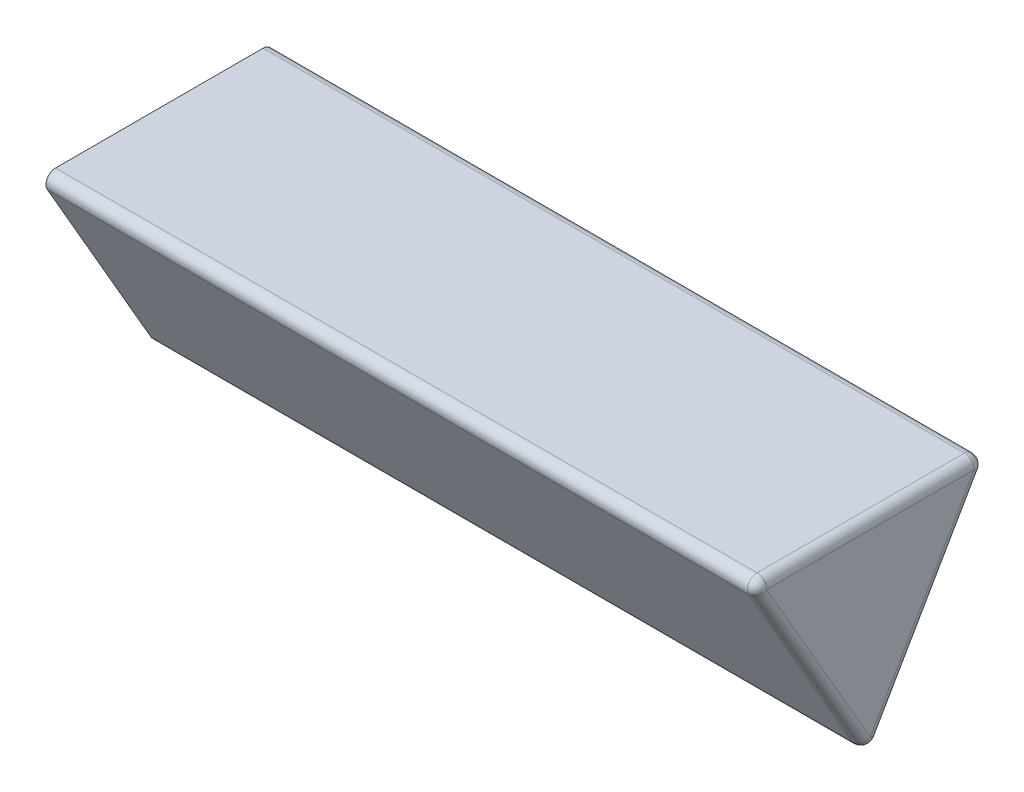
ISO-10303-21;
HEADER;
FILE_DESCRIPTION(('STEP AP214'),'2;1');
FILE_NAME('part.step','',(''),(''),'','','');
FILE_SCHEMA(('AUTOMOTIVE_DESIGN { 1 0 10303 214 1 1 1 1 }'));
ENDSEC;
DATA;
#1=APPLICATION_CONTEXT('core data for automotive mechanical design processes');
#2=APPLICATION_PROTOCOL_DEFINITION('international standard','automotive_design',2000,#1);
#3=PRODUCT_CONTEXT('',#1,'mechanical');
#4=PRODUCT('Part','Part','',(#3));
#5=PRODUCT_RELATED_PRODUCT_CATEGORY('part','',(#4));
#6=PRODUCT_DEFINITION_FORMATION('','',#4);
#7=PRODUCT_DEFINITION_CONTEXT('part definition',#1,'design');
#8=PRODUCT_DEFINITION('design','',#6,#7);
#9=PRODUCT_DEFINITION_SHAPE('','',#8);
#10=(LENGTH_UNIT() NAMED_UNIT(*) SI_UNIT(.MILLI.,.METRE.));
#11=(NAMED_UNIT(*) PLANE_ANGLE_UNIT() SI_UNIT($,.RADIAN.));
#12=(NAMED_UNIT(*) SI_UNIT($,.STERADIAN.) SOLID_ANGLE_UNIT());
#13=UNCERTAINTY_MEASURE_WITH_UNIT(LENGTH_MEASURE(1.E-05),#10,'distance_accuracy_value','');
#14=(GEOMETRIC_REPRESENTATION_CONTEXT(3) GLOBAL_UNCERTAINTY_ASSIGNED_CONTEXT((#13)) GLOBAL_UNIT_ASSIGNED_CONTEXT((#10,
#11,#12)) REPRESENTATION_CONTEXT('',''));
#15=CARTESIAN_POINT('',(0.,0.,0.));
#16=DIRECTION('',(0.,0.,1.));
#17=DIRECTION('',(1.,0.,0.));
#18=AXIS2_PLACEMENT_3D('',#15,#16,#17);
#19=CARTESIAN_POINT('',(0.,0.,0.));
#20=DIRECTION('',(1.,0.,0.));
#21=DIRECTION('',(0.,0.,-1.));
#22=AXIS2_PLACEMENT_3D('',#19,#20,#21);
#23=PLANE('',#22);
#24=DIRECTION('',(0.,0.866025403784439,-0.5));
#25=VECTOR('',#24,1.);
#26=CARTESIAN_POINT('',(0.,-36.6617420935412,0.));
#27=LINE('',#26,#25);
#28=CARTESIAN_POINT('',(0.,-32.8517420935412,-2.19970452561247));
#29=VERTEX_POINT('',#28);
#30=CARTESIAN_POINT('',(0.,14.5208710467706,-29.5502954743875));
#31=VERTEX_POINT('',#30);
#32=EDGE_CURVE('E174',#29,#31,#27,.T.);
#33=ORIENTED_EDGE('',*,*,#32,.F.);
#34=CARTESIAN_POINT('',(0.,-31.5817420935412,0.));
#35=DIRECTION('',(1.,0.,0.));
#36=DIRECTION('',(0.,0.,-1.));
#37=AXIS2_PLACEMENT_3D('',#34,#35,#36);
#38=CIRCLE('',#37,2.54);
#39=CARTESIAN_POINT('',(0.,-32.8517420935412,2.19970452561247));
#40=VERTEX_POINT('',#39);
#41=EDGE_CURVE('E234',#29,#40,#38,.F.);
#42=ORIENTED_EDGE('',*,*,#41,.T.);
#43=DIRECTION('',(0.,-0.866025403784439,-0.5));
#44=VECTOR('',#43,1.);
#45=CARTESIAN_POINT('',(0.,18.3308710467706,31.75));
#46=LINE('',#45,#44);
#47=CARTESIAN_POINT('',(0.,14.5208710467706,29.5502954743875));
#48=VERTEX_POINT('',#47);
#49=EDGE_CURVE('E180',#48,#40,#46,.T.);
#50=ORIENTED_EDGE('',*,*,#49,.F.);
#51=CARTESIAN_POINT('',(0.,15.7908710467706,27.350590948775));
#52=DIRECTION('',(1.,0.,0.));
#53=DIRECTION('',(0.,0.,-1.));
#54=AXIS2_PLACEMENT_3D('',#51,#52,#53);
#55=CIRCLE('',#54,2.54);
#56=CARTESIAN_POINT('',(0.,18.3308710467706,27.350590948775));
#57=VERTEX_POINT('',#56);
#58=EDGE_CURVE('E231',#48,#57,#55,.F.);
#59=ORIENTED_EDGE('',*,*,#58,.T.);
#60=DIRECTION('',(0.,0.,1.));
#61=VECTOR('',#60,1.);
#62=CARTESIAN_POINT('',(0.,18.3308710467706,-31.75));
#63=LINE('',#62,#61);
#64=CARTESIAN_POINT('',(0.,18.3308710467706,-27.3505909487751));
#65=VERTEX_POINT('',#64);
#66=EDGE_CURVE('E187',#65,#57,#63,.T.);
#67=ORIENTED_EDGE('',*,*,#66,.F.);
#68=CARTESIAN_POINT('',(0.,15.7908710467706,-27.3505909487751));
#69=DIRECTION('',(1.,0.,0.));
#70=DIRECTION('',(0.,0.,-1.));
#71=AXIS2_PLACEMENT_3D('',#68,#69,#70);
#72=CIRCLE('',#71,2.54);
#73=EDGE_CURVE('E228',#65,#31,#72,.F.);
#74=ORIENTED_EDGE('',*,*,#73,.T.);
#75=EDGE_LOOP('',(#33,#42,#50,#59,#67,#74));
#76=FACE_BOUND('',#75,.T.);
#77=DIRECTION('',(0.,-0.866025403784438,-0.5));
#78=VECTOR('',#77,1.);
#79=CARTESIAN_POINT('',(0.,17.4143274944321,30.1625));
#80=LINE('',#79,#78);
#81=CARTESIAN_POINT('',(0.,13.6043274944321,27.9627954743875));
#82=VERTEX_POINT('',#81);
#83=CARTESIAN_POINT('',(0.,-31.0186549888641,2.19970452561248));
#84=VERTEX_POINT('',#83);
#85=EDGE_CURVE('E155',#82,#84,#80,.T.);
#86=ORIENTED_EDGE('',*,*,#85,.T.);
#87=CARTESIAN_POINT('',(0.,-29.7486549888642,0.));
#88=DIRECTION('',(1.,0.,0.));
#89=DIRECTION('',(0.,0.,-1.));
#90=AXIS2_PLACEMENT_3D('',#87,#88,#89);
#91=CIRCLE('',#90,2.54);
#92=CARTESIAN_POINT('',(0.,-31.0186549888642,-2.19970452561247));
#93=VERTEX_POINT('',#92);
#94=EDGE_CURVE('E163',#84,#93,#91,.T.);
#95=ORIENTED_EDGE('',*,*,#94,.T.);
#96=DIRECTION('',(0.,0.866025403784438,-0.5));
#97=VECTOR('',#96,1.);
#98=CARTESIAN_POINT('',(0.,-34.8286549888642,0.));
#99=LINE('',#98,#97);
#100=CARTESIAN_POINT('',(0.,13.6043274944321,-27.9627954743875));
#101=VERTEX_POINT('',#100);
#102=EDGE_CURVE('E310',#93,#101,#99,.T.);
#103=ORIENTED_EDGE('',*,*,#102,.T.);
#104=CARTESIAN_POINT('',(0.,14.8743274944321,-25.7630909487751));
#105=DIRECTION('',(1.,0.,0.));
#106=DIRECTION('',(0.,0.,-1.));
#107=AXIS2_PLACEMENT_3D('',#104,#105,#106);
#108=CIRCLE('',#107,2.54);
#109=CARTESIAN_POINT('',(0.,17.4143274944321,-25.7630909487751));
#110=VERTEX_POINT('',#109);
#111=EDGE_CURVE('E162',#101,#110,#108,.T.);
#112=ORIENTED_EDGE('',*,*,#111,.T.);
#113=DIRECTION('',(0.,0.,1.));
#114=VECTOR('',#113,1.);
#115=CARTESIAN_POINT('',(0.,17.4143274944321,-30.1625));
#116=LINE('',#115,#114);
#117=CARTESIAN_POINT('',(0.,17.4143274944321,25.763090948775));
#118=VERTEX_POINT('',#117);
#119=EDGE_CURVE('E157',#110,#118,#116,.T.);
#120=ORIENTED_EDGE('',*,*,#119,.T.);
#121=CARTESIAN_POINT('',(0.,14.8743274944321,25.763090948775));
#122=DIRECTION('',(1.,0.,0.));
#123=DIRECTION('',(0.,0.,-1.));
#124=AXIS2_PLACEMENT_3D('',#121,#122,#123);
#125=CIRCLE('',#124,2.54);
#126=EDGE_CURVE('E153',#118,#82,#125,.T.);
#127=ORIENTED_EDGE('',*,*,#126,.T.);
#128=EDGE_LOOP('',(#86,#95,#103,#112,#120,#127));
#129=FACE_BOUND('',#128,.T.);
#130=ADVANCED_FACE('F41',(#76,#129),#23,.F.);
#131=CARTESIAN_POINT('',(187.452,-36.6617420935412,0.));
#132=DIRECTION('',(0.,0.5,0.866025403784438));
#133=DIRECTION('',(0.,-0.866025403784439,0.5));
#134=AXIS2_PLACEMENT_3D('',#131,#132,#133);
#135=PLANE('',#134);
#136=DIRECTION('',(-1.,0.,0.));
#137=VECTOR('',#136,1.);
#138=CARTESIAN_POINT('',(187.452,14.5208710467706,-29.5502954743875));
#139=LINE('',#138,#137);
#140=CARTESIAN_POINT('',(184.912,14.5208710467706,-29.5502954743875));
#141=VERTEX_POINT('',#140);
#142=EDGE_CURVE('E197',#31,#141,#139,.F.);
#143=ORIENTED_EDGE('',*,*,#142,.T.);
#144=DIRECTION('',(0.,0.866025403784439,-0.5));
#145=VECTOR('',#144,1.);
#146=CARTESIAN_POINT('',(184.912,-32.8517420935412,-2.19970452561247));
#147=LINE('',#146,#145);
#148=CARTESIAN_POINT('',(184.912,-32.8517420935412,-2.19970452561247));
#149=VERTEX_POINT('',#148);
#150=EDGE_CURVE('E272',#141,#149,#147,.F.);
#151=ORIENTED_EDGE('',*,*,#150,.T.);
#152=DIRECTION('',(-1.,0.,0.));
#153=VECTOR('',#152,1.);
#154=CARTESIAN_POINT('',(187.452,-32.8517420935412,-2.19970452561247));
#155=LINE('',#154,#153);
#156=EDGE_CURVE('E201',#149,#29,#155,.T.);
#157=ORIENTED_EDGE('',*,*,#156,.T.);
#158=ORIENTED_EDGE('',*,*,#32,.T.);
#159=EDGE_LOOP('',(#143,#151,#157,#158));
#160=FACE_BOUND('',#159,.T.);
#161=ADVANCED_FACE('F352',(#160),#135,.F.);
#162=CARTESIAN_POINT('',(187.452,18.3308710467706,-31.75));
#163=DIRECTION('',(0.,-1.,0.));
#164=DIRECTION('',(0.,0.,-1.));
#165=AXIS2_PLACEMENT_3D('',#162,#163,#164);
#166=PLANE('',#165);
#167=DIRECTION('',(-1.,0.,0.));
#168=VECTOR('',#167,1.);
#169=CARTESIAN_POINT('',(187.452,18.3308710467706,27.350590948775));
#170=LINE('',#169,#168);
#171=CARTESIAN_POINT('',(184.912,18.3308710467706,27.350590948775));
#172=VERTEX_POINT('',#171);
#173=EDGE_CURVE('E221',#57,#172,#170,.F.);
#174=ORIENTED_EDGE('',*,*,#173,.T.);
#175=DIRECTION('',(0.,0.,1.));
#176=VECTOR('',#175,1.);
#177=CARTESIAN_POINT('',(184.912,18.3308710467706,-27.3505909487751));
#178=LINE('',#177,#176);
#179=CARTESIAN_POINT('',(184.912,18.3308710467706,-27.3505909487751));
#180=VERTEX_POINT('',#179);
#181=EDGE_CURVE('E59',#172,#180,#178,.F.);
#182=ORIENTED_EDGE('',*,*,#181,.T.);
#183=DIRECTION('',(-1.,0.,0.));
#184=VECTOR('',#183,1.);
#185=CARTESIAN_POINT('',(187.452,18.3308710467706,-27.3505909487751));
#186=LINE('',#185,#184);
#187=EDGE_CURVE('E218',#180,#65,#186,.T.);
#188=ORIENTED_EDGE('',*,*,#187,.T.);
#189=ORIENTED_EDGE('',*,*,#66,.T.);
#190=EDGE_LOOP('',(#174,#182,#188,#189));
#191=FACE_BOUND('',#190,.T.);
#192=ADVANCED_FACE('F434',(#191),#166,.F.);
#193=CARTESIAN_POINT('',(187.452,18.3308710467706,31.75));
#194=DIRECTION('',(0.,0.5,-0.866025403784439));
#195=DIRECTION('',(0.,0.866025403784439,0.5));
#196=AXIS2_PLACEMENT_3D('',#193,#194,#195);
#197=PLANE('',#196);
#198=DIRECTION('',(-1.,0.,0.));
#199=VECTOR('',#198,1.);
#200=CARTESIAN_POINT('',(187.452,-32.8517420935412,2.19970452561247));
#201=LINE('',#200,#199);
#202=CARTESIAN_POINT('',(184.912,-32.8517420935412,2.19970452561247));
#203=VERTEX_POINT('',#202);
#204=EDGE_CURVE('E207',#40,#203,#201,.F.);
#205=ORIENTED_EDGE('',*,*,#204,.T.);
#206=DIRECTION('',(0.,-0.866025403784439,-0.5));
#207=VECTOR('',#206,1.);
#208=CARTESIAN_POINT('',(184.912,14.5208710467706,29.5502954743875));
#209=LINE('',#208,#207);
#210=CARTESIAN_POINT('',(184.912,14.5208710467706,29.5502954743875));
#211=VERTEX_POINT('',#210);
#212=EDGE_CURVE('E279',#203,#211,#209,.F.);
#213=ORIENTED_EDGE('',*,*,#212,.T.);
#214=DIRECTION('',(-1.,0.,0.));
#215=VECTOR('',#214,1.);
#216=CARTESIAN_POINT('',(187.452,14.5208710467706,29.5502954743875));
#217=LINE('',#216,#215);
#218=EDGE_CURVE('E204',#211,#48,#217,.T.);
#219=ORIENTED_EDGE('',*,*,#218,.T.);
#220=ORIENTED_EDGE('',*,*,#49,.T.);
#221=EDGE_LOOP('',(#205,#213,#219,#220));
#222=FACE_BOUND('',#221,.T.);
#223=ADVANCED_FACE('F367',(#222),#197,.F.);
#224=CARTESIAN_POINT('',(187.452,0.,0.));
#225=DIRECTION('',(1.,0.,0.));
#226=DIRECTION('',(0.,0.,-1.));
#227=AXIS2_PLACEMENT_3D('',#224,#225,#226);
#228=PLANE('',#227);
#229=DIRECTION('',(0.,-0.866025403784439,-0.5));
#230=VECTOR('',#229,1.);
#231=CARTESIAN_POINT('',(187.452,-31.5817420935413,0.));
#232=LINE('',#231,#230);
#233=CARTESIAN_POINT('',(187.452,15.7908710467706,27.350590948775));
#234=VERTEX_POINT('',#233);
#235=CARTESIAN_POINT('',(187.452,-31.5817420935412,0.));
#236=VERTEX_POINT('',#235);
#237=EDGE_CURVE('E265',#234,#236,#232,.T.);
#238=ORIENTED_EDGE('',*,*,#237,.T.);
#239=DIRECTION('',(0.,0.866025403784439,-0.5));
#240=VECTOR('',#239,1.);
#241=CARTESIAN_POINT('',(187.452,15.7908710467706,-27.3505909487751));
#242=LINE('',#241,#240);
#243=CARTESIAN_POINT('',(187.452,15.7908710467706,-27.3505909487751));
#244=VERTEX_POINT('',#243);
#245=EDGE_CURVE('E268',#236,#244,#242,.T.);
#246=ORIENTED_EDGE('',*,*,#245,.T.);
#247=DIRECTION('',(0.,0.,1.));
#248=VECTOR('',#247,1.);
#249=CARTESIAN_POINT('',(187.452,15.7908710467706,27.350590948775));
#250=LINE('',#249,#248);
#251=EDGE_CURVE('E262',#244,#234,#250,.T.);
#252=ORIENTED_EDGE('',*,*,#251,.T.);
#253=EDGE_LOOP('',(#238,#246,#252));
#254=FACE_BOUND('',#253,.T.);
#255=ADVANCED_FACE('F438',(#254),#228,.T.);
#256=CARTESIAN_POINT('',(186.182,-34.8286549888642,0.));
#257=DIRECTION('',(0.,0.5,0.866025403784439));
#258=DIRECTION('',(0.,-0.866025403784439,0.5));
#259=AXIS2_PLACEMENT_3D('',#256,#257,#258);
#260=PLANE('',#259);
#261=DIRECTION('',(-1.,0.,0.));
#262=VECTOR('',#261,1.);
#263=CARTESIAN_POINT('',(186.182,-31.0186549888642,-2.19970452561247));
#264=LINE('',#263,#262);
#265=CARTESIAN_POINT('',(183.642,-31.0186549888642,-2.19970452561247));
#266=VERTEX_POINT('',#265);
#267=EDGE_CURVE('E193',#93,#266,#264,.F.);
#268=ORIENTED_EDGE('',*,*,#267,.T.);
#269=DIRECTION('',(0.,0.866025403784439,-0.5));
#270=VECTOR('',#269,1.);
#271=CARTESIAN_POINT('',(183.642,-34.8286549888642,0.));
#272=LINE('',#271,#270);
#273=CARTESIAN_POINT('',(183.642,13.6043274944321,-27.9627954743875));
#274=VERTEX_POINT('',#273);
#275=EDGE_CURVE('E241',#266,#274,#272,.T.);
#276=ORIENTED_EDGE('',*,*,#275,.T.);
#277=DIRECTION('',(-1.,0.,0.));
#278=VECTOR('',#277,1.);
#279=CARTESIAN_POINT('',(0.,13.6043274944321,-27.9627954743875));
#280=LINE('',#279,#278);
#281=EDGE_CURVE('E184',#274,#101,#280,.T.);
#282=ORIENTED_EDGE('',*,*,#281,.T.);
#283=ORIENTED_EDGE('',*,*,#102,.F.);
#284=EDGE_LOOP('',(#268,#276,#282,#283));
#285=FACE_BOUND('',#284,.T.);
#286=ADVANCED_FACE('F385',(#285),#260,.T.);
#287=CARTESIAN_POINT('',(186.182,17.4143274944321,-30.1625));
#288=DIRECTION('',(0.,-1.,0.));
#289=DIRECTION('',(0.,0.,-1.));
#290=AXIS2_PLACEMENT_3D('',#287,#288,#289);
#291=PLANE('',#290);
#292=DIRECTION('',(-1.,0.,0.));
#293=VECTOR('',#292,1.);
#294=CARTESIAN_POINT('',(186.182,17.4143274944321,-25.7630909487751));
#295=LINE('',#294,#293);
#296=CARTESIAN_POINT('',(183.642,17.4143274944321,-25.7630909487751));
#297=VERTEX_POINT('',#296);
#298=EDGE_CURVE('E211',#110,#297,#295,.F.);
#299=ORIENTED_EDGE('',*,*,#298,.T.);
#300=DIRECTION('',(0.,0.,1.));
#301=VECTOR('',#300,1.);
#302=CARTESIAN_POINT('',(183.642,17.4143274944321,-30.1625));
#303=LINE('',#302,#301);
#304=CARTESIAN_POINT('',(183.642,17.4143274944321,25.763090948775));
#305=VERTEX_POINT('',#304);
#306=EDGE_CURVE('E51',#297,#305,#303,.T.);
#307=ORIENTED_EDGE('',*,*,#306,.T.);
#308=DIRECTION('',(-1.,0.,0.));
#309=VECTOR('',#308,1.);
#310=CARTESIAN_POINT('',(0.,17.4143274944321,25.763090948775));
#311=LINE('',#310,#309);
#312=EDGE_CURVE('E215',#305,#118,#311,.T.);
#313=ORIENTED_EDGE('',*,*,#312,.T.);
#314=ORIENTED_EDGE('',*,*,#119,.F.);
#315=EDGE_LOOP('',(#299,#307,#313,#314));
#316=FACE_BOUND('',#315,.T.);
#317=ADVANCED_FACE('F413',(#316),#291,.T.);
#318=CARTESIAN_POINT('',(186.182,17.4143274944321,30.1625));
#319=DIRECTION('',(0.,0.5,-0.866025403784439));
#320=DIRECTION('',(0.,0.866025403784439,0.5));
#321=AXIS2_PLACEMENT_3D('',#318,#319,#320);
#322=PLANE('',#321);
#323=DIRECTION('',(-1.,0.,0.));
#324=VECTOR('',#323,1.);
#325=CARTESIAN_POINT('',(186.182,13.6043274944321,27.9627954743875));
#326=LINE('',#325,#324);
#327=CARTESIAN_POINT('',(183.642,13.6043274944321,27.9627954743875));
#328=VERTEX_POINT('',#327);
#329=EDGE_CURVE('E168',#82,#328,#326,.F.);
#330=ORIENTED_EDGE('',*,*,#329,.T.);
#331=DIRECTION('',(0.,-0.866025403784439,-0.5));
#332=VECTOR('',#331,1.);
#333=CARTESIAN_POINT('',(183.642,17.4143274944321,30.1625));
#334=LINE('',#333,#332);
#335=CARTESIAN_POINT('',(183.642,-31.0186549888642,2.19970452561248));
#336=VERTEX_POINT('',#335);
#337=EDGE_CURVE('E257',#328,#336,#334,.T.);
#338=ORIENTED_EDGE('',*,*,#337,.T.);
#339=DIRECTION('',(-1.,0.,0.));
#340=VECTOR('',#339,1.);
#341=CARTESIAN_POINT('',(0.,-31.0186549888642,2.19970452561248));
#342=LINE('',#341,#340);
#343=EDGE_CURVE('E171',#336,#84,#342,.T.);
#344=ORIENTED_EDGE('',*,*,#343,.T.);
#345=ORIENTED_EDGE('',*,*,#85,.F.);
#346=EDGE_LOOP('',(#330,#338,#344,#345));
#347=FACE_BOUND('',#346,.T.);
#348=ADVANCED_FACE('F167',(#347),#322,.T.);
#349=CARTESIAN_POINT('',(186.182,0.,0.));
#350=DIRECTION('',(1.,0.,0.));
#351=DIRECTION('',(0.,0.,-1.));
#352=AXIS2_PLACEMENT_3D('',#349,#350,#351);
#353=PLANE('',#352);
#354=DIRECTION('',(0.,0.,1.));
#355=VECTOR('',#354,1.);
#356=CARTESIAN_POINT('',(186.182,14.8743274944321,0.));
#357=LINE('',#356,#355);
#358=CARTESIAN_POINT('',(186.182,14.8743274944321,25.763090948775));
#359=VERTEX_POINT('',#358);
#360=CARTESIAN_POINT('',(186.182,14.8743274944321,-25.7630909487751));
#361=VERTEX_POINT('',#360);
#362=EDGE_CURVE('E244',#359,#361,#357,.F.);
#363=ORIENTED_EDGE('',*,*,#362,.T.);
#364=DIRECTION('',(0.,0.866025403784439,-0.5));
#365=VECTOR('',#364,1.);
#366=CARTESIAN_POINT('',(186.182,-7.43716374721605,-12.8815454743875));
#367=LINE('',#366,#365);
#368=CARTESIAN_POINT('',(186.182,-29.7486549888642,0.));
#369=VERTEX_POINT('',#368);
#370=EDGE_CURVE('E250',#361,#369,#367,.F.);
#371=ORIENTED_EDGE('',*,*,#370,.T.);
#372=DIRECTION('',(0.,-0.866025403784439,-0.5));
#373=VECTOR('',#372,1.);
#374=CARTESIAN_POINT('',(186.182,-7.43716374721604,12.8815454743875));
#375=LINE('',#374,#373);
#376=EDGE_CURVE('E247',#369,#359,#375,.F.);
#377=ORIENTED_EDGE('',*,*,#376,.T.);
#378=EDGE_LOOP('',(#363,#371,#377));
#379=FACE_BOUND('',#378,.T.);
#380=ADVANCED_FACE('F420',(#379),#353,.F.);
#381=CARTESIAN_POINT('',(186.182,-29.7486549888642,0.));
#382=DIRECTION('',(1.,0.,0.));
#383=DIRECTION('',(0.,0.,-1.));
#384=AXIS2_PLACEMENT_3D('',#381,#382,#383);
#385=CYLINDRICAL_SURFACE('',#384,2.54);
#386=ORIENTED_EDGE('',*,*,#343,.F.);
#387=CARTESIAN_POINT('',(183.642,-29.7486549888642,0.));
#388=DIRECTION('',(1.,0.,0.));
#389=DIRECTION('',(0.,0.,-1.));
#390=AXIS2_PLACEMENT_3D('',#387,#388,#389);
#391=CIRCLE('',#390,2.54);
#392=EDGE_CURVE('E254',#336,#266,#391,.T.);
#393=ORIENTED_EDGE('',*,*,#392,.T.);
#394=ORIENTED_EDGE('',*,*,#267,.F.);
#395=ORIENTED_EDGE('',*,*,#94,.F.);
#396=EDGE_LOOP('',(#386,#393,#394,#395));
#397=FACE_BOUND('',#396,.T.);
#398=ADVANCED_FACE('F389',(#397),#385,.F.);
#399=CARTESIAN_POINT('',(187.452,-31.5817420935412,0.));
#400=DIRECTION('',(-1.,0.,0.));
#401=DIRECTION('',(0.,0.,1.));
#402=AXIS2_PLACEMENT_3D('',#399,#400,#401);
#403=CYLINDRICAL_SURFACE('',#402,2.54);
#404=ORIENTED_EDGE('',*,*,#156,.F.);
#405=CARTESIAN_POINT('',(184.912,-31.5817420935412,0.));
#406=DIRECTION('',(-1.,0.,0.));
#407=DIRECTION('',(0.,0.,1.));
#408=AXIS2_PLACEMENT_3D('',#405,#406,#407);
#409=CIRCLE('',#408,2.54);
#410=EDGE_CURVE('E276',#149,#203,#409,.T.);
#411=ORIENTED_EDGE('',*,*,#410,.T.);
#412=ORIENTED_EDGE('',*,*,#204,.F.);
#413=ORIENTED_EDGE('',*,*,#41,.F.);
#414=EDGE_LOOP('',(#404,#411,#412,#413));
#415=FACE_BOUND('',#414,.T.);
#416=ADVANCED_FACE('F364',(#415),#403,.T.);
#417=CARTESIAN_POINT('',(186.182,14.8743274944321,25.763090948775));
#418=DIRECTION('',(1.,0.,0.));
#419=DIRECTION('',(0.,0.,-1.));
#420=AXIS2_PLACEMENT_3D('',#417,#418,#419);
#421=CYLINDRICAL_SURFACE('',#420,2.54);
#422=ORIENTED_EDGE('',*,*,#312,.F.);
#423=CARTESIAN_POINT('',(183.642,14.8743274944321,25.763090948775));
#424=DIRECTION('',(1.,0.,0.));
#425=DIRECTION('',(0.,0.,-1.));
#426=AXIS2_PLACEMENT_3D('',#423,#424,#425);
#427=CIRCLE('',#426,2.54);
#428=EDGE_CURVE('E178',#305,#328,#427,.T.);
#429=ORIENTED_EDGE('',*,*,#428,.T.);
#430=ORIENTED_EDGE('',*,*,#329,.F.);
#431=ORIENTED_EDGE('',*,*,#126,.F.);
#432=EDGE_LOOP('',(#422,#429,#430,#431));
#433=FACE_BOUND('',#432,.T.);
#434=ADVANCED_FACE('F176',(#433),#421,.F.);
#435=CARTESIAN_POINT('',(187.452,15.7908710467706,27.350590948775));
#436=DIRECTION('',(-1.,0.,0.));
#437=DIRECTION('',(0.,0.,1.));
#438=AXIS2_PLACEMENT_3D('',#435,#436,#437);
#439=CYLINDRICAL_SURFACE('',#438,2.54);
#440=ORIENTED_EDGE('',*,*,#218,.F.);
#441=CARTESIAN_POINT('',(184.912,15.7908710467706,27.350590948775));
#442=DIRECTION('',(-1.,0.,0.));
#443=DIRECTION('',(0.,0.,1.));
#444=AXIS2_PLACEMENT_3D('',#441,#442,#443);
#445=CIRCLE('',#444,2.54);
#446=EDGE_CURVE('E67',#211,#172,#445,.T.);
#447=ORIENTED_EDGE('',*,*,#446,.T.);
#448=ORIENTED_EDGE('',*,*,#173,.F.);
#449=ORIENTED_EDGE('',*,*,#58,.F.);
#450=EDGE_LOOP('',(#440,#447,#448,#449));
#451=FACE_BOUND('',#450,.T.);
#452=ADVANCED_FACE('F448',(#451),#439,.T.);
#453=CARTESIAN_POINT('',(186.182,14.8743274944321,-25.7630909487751));
#454=DIRECTION('',(1.,0.,0.));
#455=DIRECTION('',(0.,0.,-1.));
#456=AXIS2_PLACEMENT_3D('',#453,#454,#455);
#457=CYLINDRICAL_SURFACE('',#456,2.54);
#458=ORIENTED_EDGE('',*,*,#281,.F.);
#459=CARTESIAN_POINT('',(183.642,14.8743274944321,-25.7630909487751));
#460=DIRECTION('',(1.,0.,0.));
#461=DIRECTION('',(0.,0.,-1.));
#462=AXIS2_PLACEMENT_3D('',#459,#460,#461);
#463=CIRCLE('',#462,2.54);
#464=EDGE_CURVE('E237',#274,#297,#463,.T.);
#465=ORIENTED_EDGE('',*,*,#464,.T.);
#466=ORIENTED_EDGE('',*,*,#298,.F.);
#467=ORIENTED_EDGE('',*,*,#111,.F.);
#468=EDGE_LOOP('',(#458,#465,#466,#467));
#469=FACE_BOUND('',#468,.T.);
#470=ADVANCED_FACE('F402',(#469),#457,.F.);
#471=CARTESIAN_POINT('',(187.452,15.7908710467706,-27.3505909487751));
#472=DIRECTION('',(-1.,0.,0.));
#473=DIRECTION('',(0.,0.,1.));
#474=AXIS2_PLACEMENT_3D('',#471,#472,#473);
#475=CYLINDRICAL_SURFACE('',#474,2.54);
#476=ORIENTED_EDGE('',*,*,#187,.F.);
#477=CARTESIAN_POINT('',(184.912,15.7908710467706,-27.3505909487751));
#478=DIRECTION('',(-1.,0.,0.));
#479=DIRECTION('',(0.,0.,1.));
#480=AXIS2_PLACEMENT_3D('',#477,#478,#479);
#481=CIRCLE('',#480,2.54);
#482=EDGE_CURVE('E11',#180,#141,#481,.T.);
#483=ORIENTED_EDGE('',*,*,#482,.T.);
#484=ORIENTED_EDGE('',*,*,#142,.F.);
#485=ORIENTED_EDGE('',*,*,#73,.F.);
#486=EDGE_LOOP('',(#476,#483,#484,#485));
#487=FACE_BOUND('',#486,.T.);
#488=ADVANCED_FACE('F347',(#487),#475,.T.);
#489=CARTESIAN_POINT('',(183.642,18.6843274944321,27.9627954743875));
#490=DIRECTION('',(0.,-0.866025403784439,-0.5));
#491=DIRECTION('',(0.,0.5,-0.866025403784439));
#492=AXIS2_PLACEMENT_3D('',#489,#490,#491);
#493=CYLINDRICAL_SURFACE('',#492,2.54);
#494=CARTESIAN_POINT('',(183.642,-29.7486549888642,0.));
#495=DIRECTION('',(0.,0.866025403784438,0.5));
#496=DIRECTION('',(0.,-0.5,0.866025403784439));
#497=AXIS2_PLACEMENT_3D('',#494,#495,#496);
#498=CIRCLE('',#497,2.54);
#499=EDGE_CURVE('E302',#336,#369,#498,.T.);
#500=ORIENTED_EDGE('',*,*,#499,.F.);
#501=ORIENTED_EDGE('',*,*,#337,.F.);
#502=CARTESIAN_POINT('',(183.642,14.8743274944321,25.763090948775));
#503=DIRECTION('',(0.,-0.866025403784438,-0.5));
#504=DIRECTION('',(0.,0.5,-0.866025403784439));
#505=AXIS2_PLACEMENT_3D('',#502,#503,#504);
#506=CIRCLE('',#505,2.54);
#507=EDGE_CURVE('E306',#359,#328,#506,.T.);
#508=ORIENTED_EDGE('',*,*,#507,.F.);
#509=ORIENTED_EDGE('',*,*,#376,.F.);
#510=EDGE_LOOP('',(#500,#501,#508,#509));
#511=FACE_BOUND('',#510,.T.);
#512=ADVANCED_FACE('F418',(#511),#493,.F.);
#513=CARTESIAN_POINT('',(183.642,14.8743274944321,25.763090948775));
#514=DIRECTION('',(1.,0.,0.));
#515=DIRECTION('',(0.,0.,-1.));
#516=AXIS2_PLACEMENT_3D('',#513,#514,#515);
#517=SPHERICAL_SURFACE('',#516,2.54);
#518=ORIENTED_EDGE('',*,*,#507,.T.);
#519=ORIENTED_EDGE('',*,*,#428,.F.);
#520=CARTESIAN_POINT('',(183.642,14.8743274944321,25.763090948775));
#521=DIRECTION('',(0.,0.,1.));
#522=DIRECTION('',(1.,0.,0.));
#523=AXIS2_PLACEMENT_3D('',#520,#521,#522);
#524=CIRCLE('',#523,2.54);
#525=EDGE_CURVE('E298',#359,#305,#524,.T.);
#526=ORIENTED_EDGE('',*,*,#525,.F.);
#527=EDGE_LOOP('',(#518,#519,#526));
#528=FACE_BOUND('',#527,.T.);
#529=ADVANCED_FACE('F415',(#528),#517,.F.);
#530=CARTESIAN_POINT('',(183.642,-29.7486549888642,0.));
#531=DIRECTION('',(1.,0.,0.));
#532=DIRECTION('',(0.,0.,-1.));
#533=AXIS2_PLACEMENT_3D('',#530,#531,#532);
#534=SPHERICAL_SURFACE('',#533,2.54);
#535=ORIENTED_EDGE('',*,*,#392,.F.);
#536=ORIENTED_EDGE('',*,*,#499,.T.);
#537=CARTESIAN_POINT('',(183.642,-29.7486549888642,0.));
#538=DIRECTION('',(0.,-0.866025403784438,0.5));
#539=DIRECTION('',(0.,-0.5,-0.866025403784439));
#540=AXIS2_PLACEMENT_3D('',#537,#538,#539);
#541=CIRCLE('',#540,2.54);
#542=EDGE_CURVE('E295',#266,#369,#541,.T.);
#543=ORIENTED_EDGE('',*,*,#542,.F.);
#544=EDGE_LOOP('',(#535,#536,#543));
#545=FACE_BOUND('',#544,.T.);
#546=ADVANCED_FACE('F393',(#545),#534,.F.);
#547=CARTESIAN_POINT('',(183.642,14.8743274944321,-30.1625));
#548=DIRECTION('',(0.,0.,1.));
#549=DIRECTION('',(0.,-1.,0.));
#550=AXIS2_PLACEMENT_3D('',#547,#548,#549);
#551=CYLINDRICAL_SURFACE('',#550,2.54);
#552=ORIENTED_EDGE('',*,*,#525,.T.);
#553=ORIENTED_EDGE('',*,*,#306,.F.);
#554=CARTESIAN_POINT('',(183.642,14.8743274944321,-25.7630909487751));
#555=DIRECTION('',(0.,0.,1.));
#556=DIRECTION('',(1.,0.,0.));
#557=AXIS2_PLACEMENT_3D('',#554,#555,#556);
#558=CIRCLE('',#557,2.54);
#559=EDGE_CURVE('E292',#361,#297,#558,.T.);
#560=ORIENTED_EDGE('',*,*,#559,.F.);
#561=ORIENTED_EDGE('',*,*,#362,.F.);
#562=EDGE_LOOP('',(#552,#553,#560,#561));
#563=FACE_BOUND('',#562,.T.);
#564=ADVANCED_FACE('F410',(#563),#551,.F.);
#565=CARTESIAN_POINT('',(183.642,-33.5586549888642,2.19970452561248));
#566=DIRECTION('',(0.,0.866025403784439,-0.5));
#567=DIRECTION('',(0.,0.5,0.866025403784439));
#568=AXIS2_PLACEMENT_3D('',#565,#566,#567);
#569=CYLINDRICAL_SURFACE('',#568,2.54);
#570=ORIENTED_EDGE('',*,*,#542,.T.);
#571=ORIENTED_EDGE('',*,*,#370,.F.);
#572=CARTESIAN_POINT('',(183.642,14.8743274944321,-25.7630909487751));
#573=DIRECTION('',(0.,-0.866025403784438,0.5));
#574=DIRECTION('',(0.,-0.5,-0.866025403784439));
#575=AXIS2_PLACEMENT_3D('',#572,#573,#574);
#576=CIRCLE('',#575,2.54);
#577=EDGE_CURVE('E288',#274,#361,#576,.T.);
#578=ORIENTED_EDGE('',*,*,#577,.F.);
#579=ORIENTED_EDGE('',*,*,#275,.F.);
#580=EDGE_LOOP('',(#570,#571,#578,#579));
#581=FACE_BOUND('',#580,.T.);
#582=ADVANCED_FACE('F399',(#581),#569,.F.);
#583=CARTESIAN_POINT('',(183.642,14.8743274944321,-25.7630909487751));
#584=DIRECTION('',(1.,0.,0.));
#585=DIRECTION('',(0.,0.,-1.));
#586=AXIS2_PLACEMENT_3D('',#583,#584,#585);
#587=SPHERICAL_SURFACE('',#586,2.54);
#588=ORIENTED_EDGE('',*,*,#559,.T.);
#589=ORIENTED_EDGE('',*,*,#464,.F.);
#590=ORIENTED_EDGE('',*,*,#577,.T.);
#591=EDGE_LOOP('',(#588,#589,#590));
#592=FACE_BOUND('',#591,.T.);
#593=ADVANCED_FACE('F405',(#592),#587,.F.);
#594=CARTESIAN_POINT('',(184.912,15.7908710467706,27.350590948775));
#595=DIRECTION('',(1.,0.,0.));
#596=DIRECTION('',(0.,0.,-1.));
#597=AXIS2_PLACEMENT_3D('',#594,#595,#596);
#598=SPHERICAL_SURFACE('',#597,2.54);
#599=CARTESIAN_POINT('',(184.912,15.7908710467706,27.350590948775));
#600=DIRECTION('',(0.,0.,-1.));
#601=DIRECTION('',(-1.,0.,0.));
#602=AXIS2_PLACEMENT_3D('',#599,#600,#601);
#603=CIRCLE('',#602,2.54);
#604=EDGE_CURVE('E324',#172,#234,#603,.T.);
#605=ORIENTED_EDGE('',*,*,#604,.F.);
#606=ORIENTED_EDGE('',*,*,#446,.F.);
#607=CARTESIAN_POINT('',(184.912,15.7908710467706,27.350590948775));
#608=DIRECTION('',(0.,-0.866025403784438,-0.5));
#609=DIRECTION('',(0.,0.5,-0.866025403784439));
#610=AXIS2_PLACEMENT_3D('',#607,#608,#609);
#611=CIRCLE('',#610,2.54);
#612=EDGE_CURVE('E45',#234,#211,#611,.T.);
#613=ORIENTED_EDGE('',*,*,#612,.F.);
#614=EDGE_LOOP('',(#605,#606,#613));
#615=FACE_BOUND('',#614,.T.);
#616=ADVANCED_FACE('F43',(#615),#598,.T.);
#617=CARTESIAN_POINT('',(184.912,-7.89543552338531,13.6752954743875));
#618=DIRECTION('',(0.,0.866025403784439,0.5));
#619=DIRECTION('',(0.,-0.5,0.866025403784439));
#620=AXIS2_PLACEMENT_3D('',#617,#618,#619);
#621=CYLINDRICAL_SURFACE('',#620,2.54);
#622=ORIENTED_EDGE('',*,*,#612,.T.);
#623=ORIENTED_EDGE('',*,*,#212,.F.);
#624=CARTESIAN_POINT('',(184.912,-31.5817420935412,0.));
#625=DIRECTION('',(0.,-0.866025403784438,-0.500000000000001));
#626=DIRECTION('',(0.,0.500000000000001,-0.866025403784438));
#627=AXIS2_PLACEMENT_3D('',#624,#625,#626);
#628=CIRCLE('',#627,2.54);
#629=EDGE_CURVE('E321',#236,#203,#628,.T.);
#630=ORIENTED_EDGE('',*,*,#629,.F.);
#631=ORIENTED_EDGE('',*,*,#237,.F.);
#632=EDGE_LOOP('',(#622,#623,#630,#631));
#633=FACE_BOUND('',#632,.T.);
#634=ADVANCED_FACE('F336',(#633),#621,.T.);
#635=CARTESIAN_POINT('',(184.912,15.7908710467706,0.));
#636=DIRECTION('',(0.,0.,-1.));
#637=DIRECTION('',(0.,1.,0.));
#638=AXIS2_PLACEMENT_3D('',#635,#636,#637);
#639=CYLINDRICAL_SURFACE('',#638,2.54);
#640=ORIENTED_EDGE('',*,*,#604,.T.);
#641=ORIENTED_EDGE('',*,*,#251,.F.);
#642=CARTESIAN_POINT('',(184.912,15.7908710467706,-27.3505909487751));
#643=DIRECTION('',(0.,0.,-1.));
#644=DIRECTION('',(-1.,0.,0.));
#645=AXIS2_PLACEMENT_3D('',#642,#643,#644);
#646=CIRCLE('',#645,2.54);
#647=EDGE_CURVE('E317',#180,#244,#646,.T.);
#648=ORIENTED_EDGE('',*,*,#647,.F.);
#649=ORIENTED_EDGE('',*,*,#181,.F.);
#650=EDGE_LOOP('',(#640,#641,#648,#649));
#651=FACE_BOUND('',#650,.T.);
#652=ADVANCED_FACE('F340',(#651),#639,.T.);
#653=CARTESIAN_POINT('',(184.912,-31.5817420935412,0.));
#654=DIRECTION('',(1.,0.,0.));
#655=DIRECTION('',(0.,0.,-1.));
#656=AXIS2_PLACEMENT_3D('',#653,#654,#655);
#657=SPHERICAL_SURFACE('',#656,2.54);
#658=ORIENTED_EDGE('',*,*,#629,.T.);
#659=ORIENTED_EDGE('',*,*,#410,.F.);
#660=CARTESIAN_POINT('',(184.912,-31.5817420935412,0.));
#661=DIRECTION('',(0.,0.866025403784439,-0.5));
#662=DIRECTION('',(0.,0.5,0.866025403784439));
#663=AXIS2_PLACEMENT_3D('',#660,#661,#662);
#664=CIRCLE('',#663,2.54);
#665=EDGE_CURVE('E314',#236,#149,#664,.T.);
#666=ORIENTED_EDGE('',*,*,#665,.F.);
#667=EDGE_LOOP('',(#658,#659,#666));
#668=FACE_BOUND('',#667,.T.);
#669=ADVANCED_FACE('F361',(#668),#657,.T.);
#670=CARTESIAN_POINT('',(184.912,15.7908710467706,-27.3505909487751));
#671=DIRECTION('',(1.,0.,0.));
#672=DIRECTION('',(0.,0.,-1.));
#673=AXIS2_PLACEMENT_3D('',#670,#671,#672);
#674=SPHERICAL_SURFACE('',#673,2.54);
#675=ORIENTED_EDGE('',*,*,#482,.F.);
#676=ORIENTED_EDGE('',*,*,#647,.T.);
#677=CARTESIAN_POINT('',(184.912,15.7908710467706,-27.3505909487751));
#678=DIRECTION('',(0.,-0.866025403784439,0.499999999999999));
#679=DIRECTION('',(0.,-0.499999999999999,-0.866025403784439));
#680=AXIS2_PLACEMENT_3D('',#677,#678,#679);
#681=CIRCLE('',#680,2.54);
#682=EDGE_CURVE('E311',#141,#244,#681,.T.);
#683=ORIENTED_EDGE('',*,*,#682,.F.);
#684=EDGE_LOOP('',(#675,#676,#683));
#685=FACE_BOUND('',#684,.T.);
#686=ADVANCED_FACE('F344',(#685),#674,.T.);
#687=CARTESIAN_POINT('',(184.912,-7.89543552338531,-13.6752954743875));
#688=DIRECTION('',(0.,-0.866025403784439,0.5));
#689=DIRECTION('',(0.,-0.5,-0.866025403784439));
#690=AXIS2_PLACEMENT_3D('',#687,#688,#689);
#691=CYLINDRICAL_SURFACE('',#690,2.54);
#692=ORIENTED_EDGE('',*,*,#665,.T.);
#693=ORIENTED_EDGE('',*,*,#150,.F.);
#694=ORIENTED_EDGE('',*,*,#682,.T.);
#695=ORIENTED_EDGE('',*,*,#245,.F.);
#696=EDGE_LOOP('',(#692,#693,#694,#695));
#697=FACE_BOUND('',#696,.T.);
#698=ADVANCED_FACE('F356',(#697),#691,.T.);
#699=CLOSED_SHELL('',(#130,#161,#192,#223,#255,#286,#317,#348,#380,#398,#416,#434,#452,#470,
#488,#512,#529,#546,#564,#582,#593,#616,#634,#652,#669,#686,#698));
#700=MANIFOLD_SOLID_BREP('B2',#699);
#701=ADVANCED_BREP_SHAPE_REPRESENTATION('',(#18,#700),#14);
#702=SHAPE_DEFINITION_REPRESENTATION(#9,#701);
ENDSEC;
END-ISO-10303-21;
